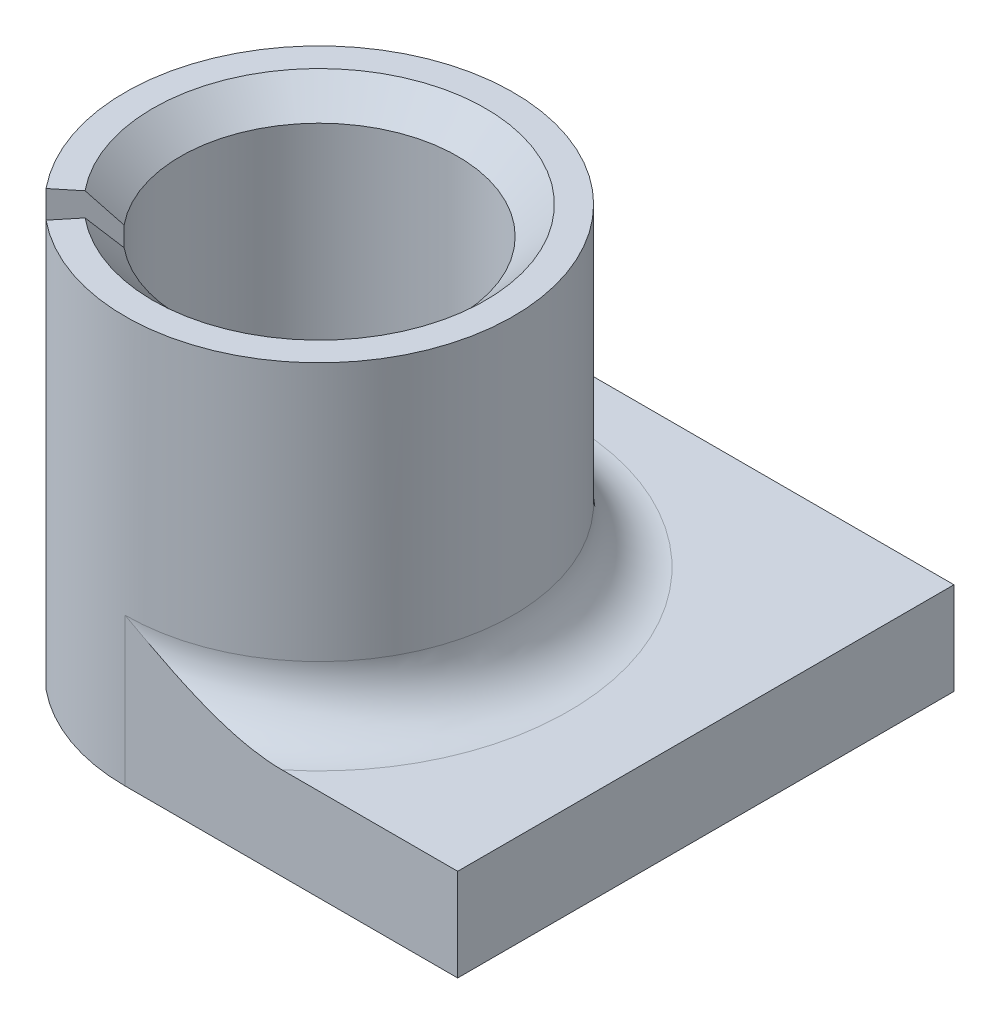
ISO-10303-21;
HEADER;
FILE_DESCRIPTION(('STEP AP214'),'2;1');
FILE_NAME('part.step','',(''),(''),'','','');
FILE_SCHEMA(('AUTOMOTIVE_DESIGN { 1 0 10303 214 1 1 1 1 }'));
ENDSEC;
DATA;
#1=APPLICATION_CONTEXT('core data for automotive mechanical design processes');
#2=APPLICATION_PROTOCOL_DEFINITION('international standard','automotive_design',2000,#1);
#3=PRODUCT_CONTEXT('',#1,'mechanical');
#4=PRODUCT('Part','Part','',(#3));
#5=PRODUCT_RELATED_PRODUCT_CATEGORY('part','',(#4));
#6=PRODUCT_DEFINITION_FORMATION('','',#4);
#7=PRODUCT_DEFINITION_CONTEXT('part definition',#1,'design');
#8=PRODUCT_DEFINITION('design','',#6,#7);
#9=PRODUCT_DEFINITION_SHAPE('','',#8);
#10=(LENGTH_UNIT() NAMED_UNIT(*) SI_UNIT(.MILLI.,.METRE.));
#11=(NAMED_UNIT(*) PLANE_ANGLE_UNIT() SI_UNIT($,.RADIAN.));
#12=(NAMED_UNIT(*) SI_UNIT($,.STERADIAN.) SOLID_ANGLE_UNIT());
#13=UNCERTAINTY_MEASURE_WITH_UNIT(LENGTH_MEASURE(1.E-05),#10,'distance_accuracy_value','');
#14=(GEOMETRIC_REPRESENTATION_CONTEXT(3) GLOBAL_UNCERTAINTY_ASSIGNED_CONTEXT((#13)) GLOBAL_UNIT_ASSIGNED_CONTEXT((#10,
#11,#12)) REPRESENTATION_CONTEXT('',''));
#15=CARTESIAN_POINT('',(0.,0.,0.));
#16=DIRECTION('',(0.,0.,1.));
#17=DIRECTION('',(1.,0.,0.));
#18=AXIS2_PLACEMENT_3D('',#15,#16,#17);
#19=CARTESIAN_POINT('',(0.,-65.,0.));
#20=DIRECTION('',(0.,-1.,0.));
#21=DIRECTION('',(0.,0.,-1.));
#22=AXIS2_PLACEMENT_3D('',#19,#20,#21);
#23=PLANE('',#22);
#24=DIRECTION('',(0.,0.,1.));
#25=VECTOR('',#24,1.);
#26=CARTESIAN_POINT('',(-75.0061870314862,-65.,33.1511391972535));
#27=LINE('',#26,#25);
#28=CARTESIAN_POINT('',(-75.0061870314862,-65.,33.1511391972535));
#29=VERTEX_POINT('',#28);
#30=CARTESIAN_POINT('',(-75.0061870314862,-65.,60.));
#31=VERTEX_POINT('',#30);
#32=EDGE_CURVE('E130',#29,#31,#27,.T.);
#33=ORIENTED_EDGE('',*,*,#32,.T.);
#34=DIRECTION('',(1.,0.,0.));
#35=VECTOR('',#34,1.);
#36=CARTESIAN_POINT('',(-103.5,-65.,60.));
#37=LINE('',#36,#35);
#38=CARTESIAN_POINT('',(-93.,-65.,60.));
#39=VERTEX_POINT('',#38);
#40=EDGE_CURVE('E183',#39,#31,#37,.T.);
#41=ORIENTED_EDGE('',*,*,#40,.F.);
#42=CARTESIAN_POINT('',(-93.,-65.,49.5));
#43=DIRECTION('',(0.,-1.,0.));
#44=DIRECTION('',(0.,0.,-1.));
#45=AXIS2_PLACEMENT_3D('',#42,#43,#44);
#46=CIRCLE('',#45,10.5);
#47=CARTESIAN_POINT('',(-99.644942701476,-65.,57.6298669419678));
#48=VERTEX_POINT('',#47);
#49=EDGE_CURVE('E178',#39,#48,#46,.T.);
#50=ORIENTED_EDGE('',*,*,#49,.T.);
#51=DIRECTION('',(-0.632851685854857,0.,0.774273042092171));
#52=VECTOR('',#51,1.);
#53=CARTESIAN_POINT('',(-97.7463876439114,-65.,55.3070478156913));
#54=LINE('',#53,#52);
#55=CARTESIAN_POINT('',(-97.7463876439114,-65.,55.3070478156913));
#56=VERTEX_POINT('',#55);
#57=EDGE_CURVE('E150',#56,#48,#54,.T.);
#58=ORIENTED_EDGE('',*,*,#57,.F.);
#59=CARTESIAN_POINT('',(-93.,-65.,49.5));
#60=DIRECTION('',(0.,1.,0.));
#61=DIRECTION('',(0.,0.,-1.));
#62=AXIS2_PLACEMENT_3D('',#59,#60,#61);
#63=CIRCLE('',#62,7.50000000000001);
#64=CARTESIAN_POINT('',(-98.8070478156912,-65.,54.2463876439115));
#65=VERTEX_POINT('',#64);
#66=EDGE_CURVE('E170',#56,#65,#63,.T.);
#67=ORIENTED_EDGE('',*,*,#66,.T.);
#68=DIRECTION('',(0.774273042092169,0.,-0.63285168585486));
#69=VECTOR('',#68,1.);
#70=CARTESIAN_POINT('',(-98.8070478156912,-65.,54.2463876439115));
#71=LINE('',#70,#69);
#72=CARTESIAN_POINT('',(-101.129866941968,-65.,56.144942701476));
#73=VERTEX_POINT('',#72);
#74=EDGE_CURVE('E148',#73,#65,#71,.T.);
#75=ORIENTED_EDGE('',*,*,#74,.F.);
#76=CARTESIAN_POINT('',(-103.5,-65.,49.5));
#77=VERTEX_POINT('',#76);
#78=EDGE_CURVE('E176',#73,#77,#46,.T.);
#79=ORIENTED_EDGE('',*,*,#78,.T.);
#80=DIRECTION('',(0.,0.,-1.));
#81=VECTOR('',#80,1.);
#82=CARTESIAN_POINT('',(-103.5,-65.,60.));
#83=LINE('',#82,#81);
#84=CARTESIAN_POINT('',(-103.5,-65.,33.1511391972535));
#85=VERTEX_POINT('',#84);
#86=EDGE_CURVE('E141',#77,#85,#83,.T.);
#87=ORIENTED_EDGE('',*,*,#86,.T.);
#88=DIRECTION('',(1.,0.,0.));
#89=VECTOR('',#88,1.);
#90=CARTESIAN_POINT('',(-122.948337471988,-65.,33.1511391972535));
#91=LINE('',#90,#89);
#92=EDGE_CURVE('E57',#85,#29,#91,.T.);
#93=ORIENTED_EDGE('',*,*,#92,.T.);
#94=EDGE_LOOP('',(#33,#41,#50,#58,#67,#75,#79,#87,#93));
#95=FACE_BOUND('',#94,.T.);
#96=ADVANCED_FACE('F41',(#95),#23,.T.);
#97=CARTESIAN_POINT('',(-93.,-65.,49.5));
#98=DIRECTION('',(0.,1.,0.));
#99=DIRECTION('',(0.,0.,1.));
#100=AXIS2_PLACEMENT_3D('',#97,#98,#99);
#101=CYLINDRICAL_SURFACE('',#100,7.50000000000001);
#102=DIRECTION('',(0.,1.,0.));
#103=VECTOR('',#102,1.);
#104=CARTESIAN_POINT('',(-97.7463876439114,-65.,55.3070478156913));
#105=LINE('',#104,#103);
#106=CARTESIAN_POINT('',(-97.7463876439114,-44.5,55.3070478156913));
#107=VERTEX_POINT('',#106);
#108=EDGE_CURVE('E156',#56,#107,#105,.T.);
#109=ORIENTED_EDGE('',*,*,#108,.T.);
#110=CARTESIAN_POINT('',(-93.,-44.5,49.5));
#111=DIRECTION('',(0.,-1.,0.));
#112=DIRECTION('',(0.,0.,-1.));
#113=AXIS2_PLACEMENT_3D('',#110,#111,#112);
#114=CIRCLE('',#113,7.50000000000001);
#115=CARTESIAN_POINT('',(-98.8070478156912,-44.5,54.2463876439115));
#116=VERTEX_POINT('',#115);
#117=EDGE_CURVE('E256',#107,#116,#114,.F.);
#118=ORIENTED_EDGE('',*,*,#117,.T.);
#119=DIRECTION('',(0.,1.,0.));
#120=VECTOR('',#119,1.);
#121=CARTESIAN_POINT('',(-98.8070478156912,-65.,54.2463876439115));
#122=LINE('',#121,#120);
#123=EDGE_CURVE('E153',#65,#116,#122,.T.);
#124=ORIENTED_EDGE('',*,*,#123,.F.);
#125=ORIENTED_EDGE('',*,*,#66,.F.);
#126=EDGE_LOOP('',(#109,#118,#124,#125));
#127=FACE_BOUND('',#126,.T.);
#128=ADVANCED_FACE('F227',(#127),#101,.F.);
#129=CARTESIAN_POINT('',(-93.,-65.,49.5));
#130=DIRECTION('',(0.,1.,0.));
#131=DIRECTION('',(0.,0.,1.));
#132=AXIS2_PLACEMENT_3D('',#129,#130,#131);
#133=CYLINDRICAL_SURFACE('',#132,10.5);
#134=CARTESIAN_POINT('',(-93.,-57.,49.5));
#135=DIRECTION('',(0.,-1.,0.));
#136=DIRECTION('',(0.,0.,-1.));
#137=AXIS2_PLACEMENT_3D('',#134,#135,#136);
#138=CIRCLE('',#137,10.5);
#139=CARTESIAN_POINT('',(-93.,-57.,60.));
#140=VERTEX_POINT('',#139);
#141=CARTESIAN_POINT('',(-103.5,-57.,49.5));
#142=VERTEX_POINT('',#141);
#143=EDGE_CURVE('E192',#140,#142,#138,.F.);
#144=ORIENTED_EDGE('',*,*,#143,.T.);
#145=DIRECTION('',(0.,1.,0.));
#146=VECTOR('',#145,1.);
#147=CARTESIAN_POINT('',(-103.5,-65.,49.5));
#148=LINE('',#147,#146);
#149=EDGE_CURVE('E174',#77,#142,#148,.T.);
#150=ORIENTED_EDGE('',*,*,#149,.F.);
#151=ORIENTED_EDGE('',*,*,#78,.F.);
#152=DIRECTION('',(0.,1.,0.));
#153=VECTOR('',#152,1.);
#154=CARTESIAN_POINT('',(-101.129866941968,-65.,56.144942701476));
#155=LINE('',#154,#153);
#156=CARTESIAN_POINT('',(-101.129866941968,-43.,56.144942701476));
#157=VERTEX_POINT('',#156);
#158=EDGE_CURVE('E163',#73,#157,#155,.T.);
#159=ORIENTED_EDGE('',*,*,#158,.T.);
#160=CARTESIAN_POINT('',(-93.,-43.,49.5));
#161=DIRECTION('',(0.,1.,0.));
#162=DIRECTION('',(0.,0.,-1.));
#163=AXIS2_PLACEMENT_3D('',#160,#161,#162);
#164=CIRCLE('',#163,10.5);
#165=CARTESIAN_POINT('',(-99.644942701476,-43.,57.6298669419678));
#166=VERTEX_POINT('',#165);
#167=EDGE_CURVE('E159',#166,#157,#164,.T.);
#168=ORIENTED_EDGE('',*,*,#167,.F.);
#169=DIRECTION('',(0.,1.,0.));
#170=VECTOR('',#169,1.);
#171=CARTESIAN_POINT('',(-99.644942701476,-65.,57.6298669419678));
#172=LINE('',#171,#170);
#173=EDGE_CURVE('E160',#48,#166,#172,.T.);
#174=ORIENTED_EDGE('',*,*,#173,.F.);
#175=ORIENTED_EDGE('',*,*,#49,.F.);
#176=DIRECTION('',(0.,1.,0.));
#177=VECTOR('',#176,1.);
#178=CARTESIAN_POINT('',(-93.,-65.,60.));
#179=LINE('',#178,#177);
#180=EDGE_CURVE('E173',#39,#140,#179,.T.);
#181=ORIENTED_EDGE('',*,*,#180,.T.);
#182=EDGE_LOOP('',(#144,#150,#151,#159,#168,#174,#175,#181));
#183=FACE_BOUND('',#182,.T.);
#184=ADVANCED_FACE('F232',(#183),#133,.T.);
#185=CARTESIAN_POINT('',(-93.,-43.,49.5));
#186=DIRECTION('',(0.,-1.,0.));
#187=DIRECTION('',(0.,0.,-1.));
#188=AXIS2_PLACEMENT_3D('',#185,#186,#187);
#189=PLANE('',#188);
#190=DIRECTION('',(0.774273042092169,0.,-0.63285168585486));
#191=VECTOR('',#190,1.);
#192=CARTESIAN_POINT('',(-98.8070478156912,-43.,54.2463876439115));
#193=LINE('',#192,#191);
#194=CARTESIAN_POINT('',(-99.9684573788295,-43.,55.1956651726938));
#195=VERTEX_POINT('',#194);
#196=EDGE_CURVE('E147',#157,#195,#193,.T.);
#197=ORIENTED_EDGE('',*,*,#196,.T.);
#198=CARTESIAN_POINT('',(-93.,-43.,49.5));
#199=DIRECTION('',(0.,-1.,0.));
#200=DIRECTION('',(0.,0.,-1.));
#201=AXIS2_PLACEMENT_3D('',#198,#199,#200);
#202=CIRCLE('',#201,9.00000000000003);
#203=CARTESIAN_POINT('',(-98.6956651726937,-43.,56.4684573788296));
#204=VERTEX_POINT('',#203);
#205=EDGE_CURVE('E65',#195,#204,#202,.T.);
#206=ORIENTED_EDGE('',*,*,#205,.T.);
#207=DIRECTION('',(-0.632851685854857,0.,0.774273042092171));
#208=VECTOR('',#207,1.);
#209=CARTESIAN_POINT('',(-97.7463876439114,-43.,55.3070478156913));
#210=LINE('',#209,#208);
#211=EDGE_CURVE('E151',#204,#166,#210,.T.);
#212=ORIENTED_EDGE('',*,*,#211,.T.);
#213=ORIENTED_EDGE('',*,*,#167,.T.);
#214=EDGE_LOOP('',(#197,#206,#212,#213));
#215=FACE_BOUND('',#214,.T.);
#216=ADVANCED_FACE('F240',(#215),#189,.F.);
#217=CARTESIAN_POINT('',(0.,-60.,0.));
#218=DIRECTION('',(0.,-1.,0.));
#219=DIRECTION('',(0.,0.,-1.));
#220=AXIS2_PLACEMENT_3D('',#217,#218,#219);
#221=PLANE('',#220);
#222=DIRECTION('',(1.,0.,0.));
#223=VECTOR('',#222,1.);
#224=CARTESIAN_POINT('',(-103.5,-60.,60.));
#225=LINE('',#224,#223);
#226=CARTESIAN_POINT('',(-84.5147186257614,-60.,60.));
#227=VERTEX_POINT('',#226);
#228=CARTESIAN_POINT('',(-75.0061870314862,-60.,60.));
#229=VERTEX_POINT('',#228);
#230=EDGE_CURVE('E184',#227,#229,#225,.T.);
#231=ORIENTED_EDGE('',*,*,#230,.T.);
#232=DIRECTION('',(0.,0.,-1.));
#233=VECTOR('',#232,1.);
#234=CARTESIAN_POINT('',(-75.0061870314862,-60.,0.));
#235=LINE('',#234,#233);
#236=CARTESIAN_POINT('',(-75.0061870314862,-60.,33.1511391972535));
#237=VERTEX_POINT('',#236);
#238=EDGE_CURVE('E145',#229,#237,#235,.T.);
#239=ORIENTED_EDGE('',*,*,#238,.T.);
#240=DIRECTION('',(-1.,0.,0.));
#241=VECTOR('',#240,1.);
#242=CARTESIAN_POINT('',(0.,-60.,33.1511391972535));
#243=LINE('',#242,#241);
#244=CARTESIAN_POINT('',(-103.5,-60.,33.1511391972535));
#245=VERTEX_POINT('',#244);
#246=EDGE_CURVE('E127',#237,#245,#243,.T.);
#247=ORIENTED_EDGE('',*,*,#246,.T.);
#248=DIRECTION('',(0.,0.,-1.));
#249=VECTOR('',#248,1.);
#250=CARTESIAN_POINT('',(-103.5,-60.,60.));
#251=LINE('',#250,#249);
#252=CARTESIAN_POINT('',(-103.5,-60.,41.0147186257615));
#253=VERTEX_POINT('',#252);
#254=EDGE_CURVE('E181',#253,#245,#251,.T.);
#255=ORIENTED_EDGE('',*,*,#254,.F.);
#256=CARTESIAN_POINT('',(-93.,-60.,49.5));
#257=DIRECTION('',(0.,-1.,0.));
#258=DIRECTION('',(0.,0.,-1.));
#259=AXIS2_PLACEMENT_3D('',#256,#257,#258);
#260=CIRCLE('',#259,13.5);
#261=EDGE_CURVE('E186',#253,#227,#260,.T.);
#262=ORIENTED_EDGE('',*,*,#261,.T.);
#263=EDGE_LOOP('',(#231,#239,#247,#255,#262));
#264=FACE_BOUND('',#263,.T.);
#265=ADVANCED_FACE('F237',(#264),#221,.F.);
#266=CARTESIAN_POINT('',(-103.5,-65.,60.));
#267=DIRECTION('',(0.,0.,1.));
#268=DIRECTION('',(1.,0.,0.));
#269=AXIS2_PLACEMENT_3D('',#266,#267,#268);
#270=PLANE('',#269);
#271=DIRECTION('',(0.,-1.,0.));
#272=VECTOR('',#271,1.);
#273=CARTESIAN_POINT('',(-75.0061870314862,-65.,60.));
#274=LINE('',#273,#272);
#275=EDGE_CURVE('E11',#229,#31,#274,.T.);
#276=ORIENTED_EDGE('',*,*,#275,.F.);
#277=ORIENTED_EDGE('',*,*,#230,.F.);
#278=CARTESIAN_POINT('',(-84.5147186257614,-60.,60.));
#279=CARTESIAN_POINT('',(-84.6399963291446,-59.9999942552518,60.));
#280=CARTESIAN_POINT('',(-84.765240313493,-59.9969006164073,60.));
#281=CARTESIAN_POINT('',(-85.0154126640919,-59.9849963137596,60.));
#282=CARTESIAN_POINT('',(-85.1403411310091,-59.9761877922795,60.));
#283=CARTESIAN_POINT('',(-85.5138607129734,-59.9419252963548,60.));
#284=CARTESIAN_POINT('',(-85.7617516132202,-59.9086301947921,60.));
#285=CARTESIAN_POINT('',(-86.2511977067392,-59.8248714435455,60.));
#286=CARTESIAN_POINT('',(-86.4927933733273,-59.7746361413188,60.));
#287=CARTESIAN_POINT('',(-86.972590789521,-59.6595347010329,60.));
#288=CARTESIAN_POINT('',(-87.2107903871592,-59.5946596893277,60.));
#289=CARTESIAN_POINT('',(-87.6893255546824,-59.4508658997129,60.));
#290=CARTESIAN_POINT('',(-87.9295674611987,-59.3716385882032,60.));
#291=CARTESIAN_POINT('',(-88.4062685689739,-59.2024595955701,60.));
#292=CARTESIAN_POINT('',(-88.6427269325122,-59.1125055756975,60.));
#293=CARTESIAN_POINT('',(-89.3470243110715,-58.8294258055252,60.));
#294=CARTESIAN_POINT('',(-89.8095604152911,-58.6231539034594,60.));
#295=CARTESIAN_POINT('',(-90.7265366771366,-58.1877648233268,60.));
#296=CARTESIAN_POINT('',(-91.180918593831,-57.9585286710295,60.));
#297=CARTESIAN_POINT('',(-92.0841914279799,-57.4894358658372,60.));
#298=CARTESIAN_POINT('',(-92.5330813819606,-57.2495773825837,60.));
#299=CARTESIAN_POINT('',(-92.987950719962,-57.0064406097678,60.));
#300=CARTESIAN_POINT('',(-92.9939753607452,-57.0032203037797,60.));
#301=CARTESIAN_POINT('',(-93.,-57.,60.));
#302=B_SPLINE_CURVE_WITH_KNOTS('',3,(#278,#279,#280,#281,#282,#283,#284,#285,#286,#287,#288,
#289,#290,#291,#292,#293,#294,#295,#296,#297,#298,#299,#300,#301),.UNSPECIFIED.,.F.,.F.,(4,2,2,
2,2,2,2,2,2,2,2,4),(0.,0.375740367074438,0.751339962663003,1.50084817634,2.2406323400064,
2.98086612326558,3.73946788808757,4.49823535466143,6.01647708822724,7.54303705660502,
9.06986110143229,9.09035500296413),.UNSPECIFIED.);
#303=EDGE_CURVE('E202',#227,#140,#302,.T.);
#304=ORIENTED_EDGE('',*,*,#303,.T.);
#305=ORIENTED_EDGE('',*,*,#180,.F.);
#306=ORIENTED_EDGE('',*,*,#40,.T.);
#307=EDGE_LOOP('',(#276,#277,#304,#305,#306));
#308=FACE_BOUND('',#307,.T.);
#309=ADVANCED_FACE('F239',(#308),#270,.T.);
#310=CARTESIAN_POINT('',(-103.5,25.,-7.));
#311=DIRECTION('',(-1.,0.,0.));
#312=DIRECTION('',(0.,-1.,0.));
#313=AXIS2_PLACEMENT_3D('',#310,#311,#312);
#314=PLANE('',#313);
#315=DIRECTION('',(0.,1.,0.));
#316=VECTOR('',#315,1.);
#317=CARTESIAN_POINT('',(-103.5,25.,33.1511391972535));
#318=LINE('',#317,#316);
#319=EDGE_CURVE('E50',#85,#245,#318,.T.);
#320=ORIENTED_EDGE('',*,*,#319,.F.);
#321=ORIENTED_EDGE('',*,*,#86,.F.);
#322=ORIENTED_EDGE('',*,*,#149,.T.);
#323=CARTESIAN_POINT('',(-103.5,-60.,41.0147186257615));
#324=CARTESIAN_POINT('',(-103.5,-59.9999942552518,41.1399963291426));
#325=CARTESIAN_POINT('',(-103.5,-59.9969006164074,41.265240313489));
#326=CARTESIAN_POINT('',(-103.5,-59.9849963137601,41.5154126640837));
#327=CARTESIAN_POINT('',(-103.5,-59.9761877922803,41.640341130999));
#328=CARTESIAN_POINT('',(-103.5,-59.9419252963565,42.013860712958));
#329=CARTESIAN_POINT('',(-103.5,-59.9086301947947,42.2617516132017));
#330=CARTESIAN_POINT('',(-103.5,-59.824871443549,42.7511977067216));
#331=CARTESIAN_POINT('',(-103.5,-59.7746361413218,42.9927933733136));
#332=CARTESIAN_POINT('',(-103.5,-59.6595347010347,43.4725907895145));
#333=CARTESIAN_POINT('',(-103.5,-59.5946596893286,43.710790387156));
#334=CARTESIAN_POINT('',(-103.5,-59.4508658997128,44.1893255546831));
#335=CARTESIAN_POINT('',(-103.5,-59.371638588203,44.4295674612001));
#336=CARTESIAN_POINT('',(-103.5,-59.2024595955692,44.906268568976));
#337=CARTESIAN_POINT('',(-103.5,-59.1125055756959,45.1427269325144));
#338=CARTESIAN_POINT('',(-103.5,-58.8294258055243,45.8470243110777));
#339=CARTESIAN_POINT('',(-103.5,-58.623153903463,46.3095604153031));
#340=CARTESIAN_POINT('',(-103.5,-58.187764823315,47.2265366771419));
#341=CARTESIAN_POINT('',(-103.5,-57.9585286709977,47.6809185938239));
#342=CARTESIAN_POINT('',(-103.5,-57.489435865863,48.584191427999));
#343=CARTESIAN_POINT('',(-103.5,-57.2495773826869,49.0330813820183));
#344=CARTESIAN_POINT('',(-103.5,-57.0064406097706,49.4879507199635));
#345=CARTESIAN_POINT('',(-103.5,-57.0032203037812,49.493975360746));
#346=CARTESIAN_POINT('',(-103.5,-57.,49.5));
#347=B_SPLINE_CURVE_WITH_KNOTS('',3,(#323,#324,#325,#326,#327,#328,#329,#330,#331,#332,#333,
#334,#335,#336,#337,#338,#339,#340,#341,#342,#343,#344,#345,#346),.UNSPECIFIED.,.F.,.F.,(4,2,2,
2,2,2,2,2,2,2,2,4),(0.,0.375740367068292,0.7513399626507,1.50084817631811,2.24063233999628,
2.98086612326559,3.73946788808941,4.49823535466438,6.01647708823904,7.54303705661207,
9.06986110143214,9.09035500296413),.UNSPECIFIED.);
#348=EDGE_CURVE('E195',#142,#253,#347,.F.);
#349=ORIENTED_EDGE('',*,*,#348,.T.);
#350=ORIENTED_EDGE('',*,*,#254,.T.);
#351=EDGE_LOOP('',(#320,#321,#322,#349,#350));
#352=FACE_BOUND('',#351,.T.);
#353=ADVANCED_FACE('F209',(#352),#314,.T.);
#354=CARTESIAN_POINT('',(-98.8070478156912,-65.,54.2463876439115));
#355=DIRECTION('',(0.63285168585486,0.,0.774273042092169));
#356=DIRECTION('',(0.774273042092169,0.,-0.63285168585486));
#357=AXIS2_PLACEMENT_3D('',#354,#355,#356);
#358=PLANE('',#357);
#359=ORIENTED_EDGE('',*,*,#123,.T.);
#360=DIRECTION('',(0.547493718553311,-0.707106781186546,-0.447493718553311));
#361=VECTOR('',#360,1.);
#362=CARTESIAN_POINT('',(-93.,-52.,49.5));
#363=LINE('',#362,#361);
#364=EDGE_CURVE('E258',#116,#195,#363,.F.);
#365=ORIENTED_EDGE('',*,*,#364,.T.);
#366=ORIENTED_EDGE('',*,*,#196,.F.);
#367=ORIENTED_EDGE('',*,*,#158,.F.);
#368=ORIENTED_EDGE('',*,*,#74,.T.);
#369=EDGE_LOOP('',(#359,#365,#366,#367,#368));
#370=FACE_BOUND('',#369,.T.);
#371=ADVANCED_FACE('F222',(#370),#358,.T.);
#372=CARTESIAN_POINT('',(-97.7463876439114,-65.,55.3070478156913));
#373=DIRECTION('',(-0.774273042092171,0.,-0.632851685854857));
#374=DIRECTION('',(-0.632851685854857,0.,0.774273042092171));
#375=AXIS2_PLACEMENT_3D('',#372,#373,#374);
#376=PLANE('',#375);
#377=ORIENTED_EDGE('',*,*,#211,.F.);
#378=DIRECTION('',(-0.447493718553309,0.707106781186546,0.547493718553312));
#379=VECTOR('',#378,1.);
#380=CARTESIAN_POINT('',(-93.,-52.,49.5));
#381=LINE('',#380,#379);
#382=EDGE_CURVE('E264',#204,#107,#381,.F.);
#383=ORIENTED_EDGE('',*,*,#382,.T.);
#384=ORIENTED_EDGE('',*,*,#108,.F.);
#385=ORIENTED_EDGE('',*,*,#57,.T.);
#386=ORIENTED_EDGE('',*,*,#173,.T.);
#387=EDGE_LOOP('',(#377,#383,#384,#385,#386));
#388=FACE_BOUND('',#387,.T.);
#389=ADVANCED_FACE('F214',(#388),#376,.T.);
#390=CARTESIAN_POINT('',(-93.,-57.,49.5));
#391=DIRECTION('',(0.,-1.,0.));
#392=DIRECTION('',(0.,0.,-1.));
#393=AXIS2_PLACEMENT_3D('',#390,#391,#392);
#394=TOROIDAL_SURFACE('',#393,13.5,3.);
#395=ORIENTED_EDGE('',*,*,#303,.F.);
#396=ORIENTED_EDGE('',*,*,#261,.F.);
#397=ORIENTED_EDGE('',*,*,#348,.F.);
#398=ORIENTED_EDGE('',*,*,#143,.F.);
#399=EDGE_LOOP('',(#395,#396,#397,#398));
#400=FACE_BOUND('',#399,.T.);
#401=ADVANCED_FACE('F211',(#400),#394,.F.);
#402=CARTESIAN_POINT('',(-93.,-44.5,49.5));
#403=DIRECTION('',(0.,1.,0.));
#404=DIRECTION('',(0.,0.,1.));
#405=AXIS2_PLACEMENT_3D('',#402,#403,#404);
#406=CONICAL_SURFACE('',#405,7.50000000000001,0.78539816339745);
#407=ORIENTED_EDGE('',*,*,#382,.F.);
#408=ORIENTED_EDGE('',*,*,#205,.F.);
#409=ORIENTED_EDGE('',*,*,#364,.F.);
#410=ORIENTED_EDGE('',*,*,#117,.F.);
#411=EDGE_LOOP('',(#407,#408,#409,#410));
#412=FACE_BOUND('',#411,.T.);
#413=ADVANCED_FACE('F44',(#412),#406,.F.);
#414=CARTESIAN_POINT('',(-75.0061870314862,-65.,33.1511391972535));
#415=DIRECTION('',(-1.,0.,0.));
#416=DIRECTION('',(0.,0.,1.));
#417=AXIS2_PLACEMENT_3D('',#414,#415,#416);
#418=PLANE('',#417);
#419=ORIENTED_EDGE('',*,*,#275,.T.);
#420=ORIENTED_EDGE('',*,*,#32,.F.);
#421=DIRECTION('',(0.,1.,0.));
#422=VECTOR('',#421,1.);
#423=CARTESIAN_POINT('',(-75.0061870314862,-65.,33.1511391972535));
#424=LINE('',#423,#422);
#425=EDGE_CURVE('E123',#29,#237,#424,.T.);
#426=ORIENTED_EDGE('',*,*,#425,.T.);
#427=ORIENTED_EDGE('',*,*,#238,.F.);
#428=EDGE_LOOP('',(#419,#420,#426,#427));
#429=FACE_BOUND('',#428,.T.);
#430=ADVANCED_FACE('F133',(#429),#418,.F.);
#431=CARTESIAN_POINT('',(-122.948337471988,-65.,33.1511391972535));
#432=DIRECTION('',(0.,0.,1.));
#433=DIRECTION('',(1.,0.,0.));
#434=AXIS2_PLACEMENT_3D('',#431,#432,#433);
#435=PLANE('',#434);
#436=ORIENTED_EDGE('',*,*,#425,.F.);
#437=ORIENTED_EDGE('',*,*,#92,.F.);
#438=ORIENTED_EDGE('',*,*,#319,.T.);
#439=ORIENTED_EDGE('',*,*,#246,.F.);
#440=EDGE_LOOP('',(#436,#437,#438,#439));
#441=FACE_BOUND('',#440,.T.);
#442=ADVANCED_FACE('F125',(#441),#435,.F.);
#443=CLOSED_SHELL('',(#96,#128,#184,#216,#265,#309,#353,#371,#389,#401,#413,#430,#442));
#444=MANIFOLD_SOLID_BREP('B2',#443);
#445=ADVANCED_BREP_SHAPE_REPRESENTATION('',(#18,#444),#14);
#446=SHAPE_DEFINITION_REPRESENTATION(#9,#445);
ENDSEC;
END-ISO-10303-21;
